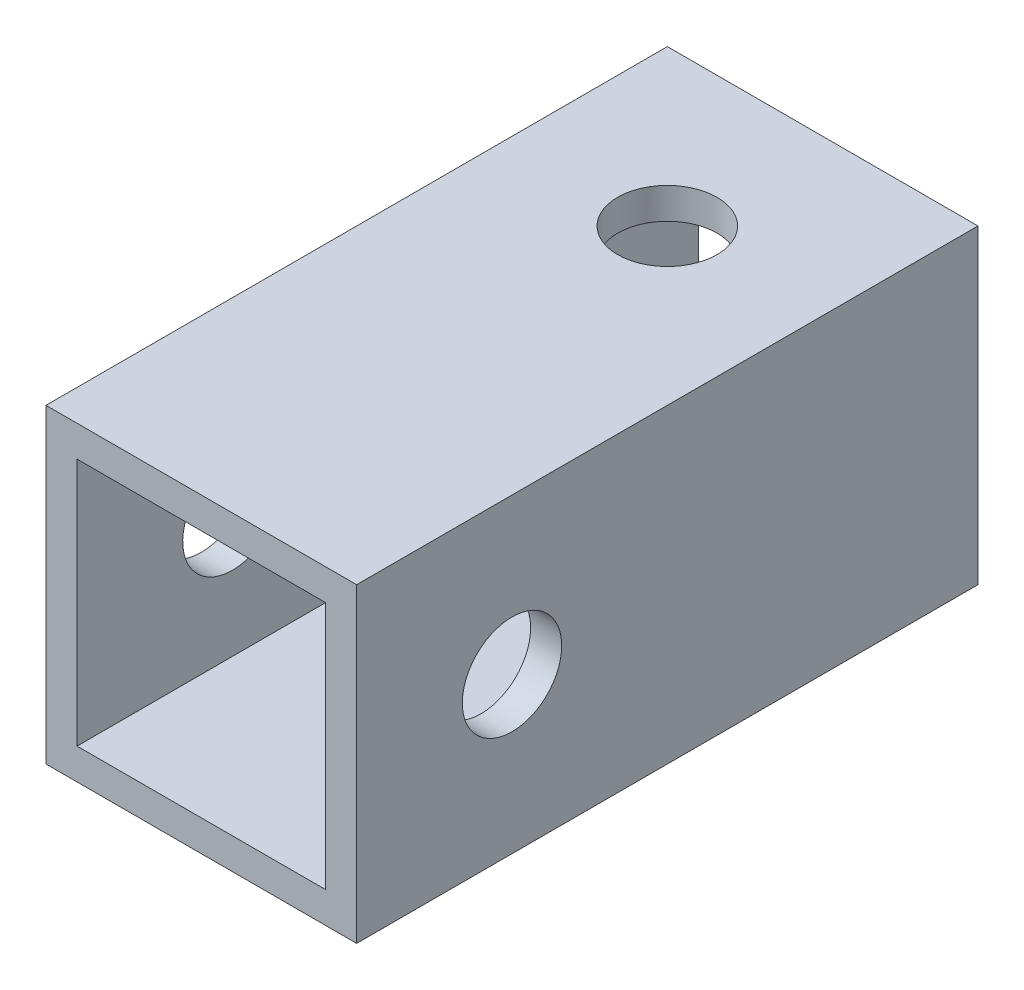
ISO-10303-21;
HEADER;
FILE_DESCRIPTION(('STEP AP214'),'2;1');
FILE_NAME('part.step','',(''),(''),'','','');
FILE_SCHEMA(('AUTOMOTIVE_DESIGN { 1 0 10303 214 1 1 1 1 }'));
ENDSEC;
DATA;
#1=APPLICATION_CONTEXT('core data for automotive mechanical design processes');
#2=APPLICATION_PROTOCOL_DEFINITION('international standard','automotive_design',2000,#1);
#3=PRODUCT_CONTEXT('',#1,'mechanical');
#4=PRODUCT('Part','Part','',(#3));
#5=PRODUCT_RELATED_PRODUCT_CATEGORY('part','',(#4));
#6=PRODUCT_DEFINITION_FORMATION('','',#4);
#7=PRODUCT_DEFINITION_CONTEXT('part definition',#1,'design');
#8=PRODUCT_DEFINITION('design','',#6,#7);
#9=PRODUCT_DEFINITION_SHAPE('','',#8);
#10=(LENGTH_UNIT() NAMED_UNIT(*) SI_UNIT(.MILLI.,.METRE.));
#11=(NAMED_UNIT(*) PLANE_ANGLE_UNIT() SI_UNIT($,.RADIAN.));
#12=(NAMED_UNIT(*) SI_UNIT($,.STERADIAN.) SOLID_ANGLE_UNIT());
#13=UNCERTAINTY_MEASURE_WITH_UNIT(LENGTH_MEASURE(1.E-05),#10,'distance_accuracy_value','');
#14=(GEOMETRIC_REPRESENTATION_CONTEXT(3) GLOBAL_UNCERTAINTY_ASSIGNED_CONTEXT((#13)) GLOBAL_UNIT_ASSIGNED_CONTEXT((#10,
#11,#12)) REPRESENTATION_CONTEXT('',''));
#15=CARTESIAN_POINT('',(0.,0.,0.));
#16=DIRECTION('',(0.,0.,1.));
#17=DIRECTION('',(1.,0.,0.));
#18=AXIS2_PLACEMENT_3D('',#15,#16,#17);
#19=CARTESIAN_POINT('',(0.,0.,20.));
#20=DIRECTION('',(0.,0.,1.));
#21=DIRECTION('',(1.,0.,0.));
#22=AXIS2_PLACEMENT_3D('',#19,#20,#21);
#23=PLANE('',#22);
#24=DIRECTION('',(0.,1.,0.));
#25=VECTOR('',#24,1.);
#26=CARTESIAN_POINT('',(5.,5.,20.));
#27=LINE('',#26,#25);
#28=CARTESIAN_POINT('',(5.,-5.,20.));
#29=VERTEX_POINT('',#28);
#30=CARTESIAN_POINT('',(5.,5.,20.));
#31=VERTEX_POINT('',#30);
#32=EDGE_CURVE('E140',#29,#31,#27,.T.);
#33=ORIENTED_EDGE('',*,*,#32,.T.);
#34=DIRECTION('',(-1.,0.,0.));
#35=VECTOR('',#34,1.);
#36=CARTESIAN_POINT('',(-5.,5.,20.));
#37=LINE('',#36,#35);
#38=CARTESIAN_POINT('',(-5.,5.,20.));
#39=VERTEX_POINT('',#38);
#40=EDGE_CURVE('E143',#31,#39,#37,.T.);
#41=ORIENTED_EDGE('',*,*,#40,.T.);
#42=DIRECTION('',(0.,-1.,0.));
#43=VECTOR('',#42,1.);
#44=CARTESIAN_POINT('',(-5.,5.,20.));
#45=LINE('',#44,#43);
#46=CARTESIAN_POINT('',(-5.,-5.,20.));
#47=VERTEX_POINT('',#46);
#48=EDGE_CURVE('E146',#39,#47,#45,.T.);
#49=ORIENTED_EDGE('',*,*,#48,.T.);
#50=DIRECTION('',(1.,0.,0.));
#51=VECTOR('',#50,1.);
#52=CARTESIAN_POINT('',(-5.,-5.,20.));
#53=LINE('',#52,#51);
#54=EDGE_CURVE('E148',#47,#29,#53,.T.);
#55=ORIENTED_EDGE('',*,*,#54,.T.);
#56=EDGE_LOOP('',(#33,#41,#49,#55));
#57=FACE_BOUND('',#56,.T.);
#58=DIRECTION('',(0.,-1.,0.));
#59=VECTOR('',#58,1.);
#60=CARTESIAN_POINT('',(-4.,4.,20.));
#61=LINE('',#60,#59);
#62=CARTESIAN_POINT('',(-4.,4.,20.));
#63=VERTEX_POINT('',#62);
#64=CARTESIAN_POINT('',(-4.,-4.,20.));
#65=VERTEX_POINT('',#64);
#66=EDGE_CURVE('E110',#63,#65,#61,.T.);
#67=ORIENTED_EDGE('',*,*,#66,.F.);
#68=DIRECTION('',(-1.,0.,0.));
#69=VECTOR('',#68,1.);
#70=CARTESIAN_POINT('',(-4.,4.,20.));
#71=LINE('',#70,#69);
#72=CARTESIAN_POINT('',(4.,4.,20.));
#73=VERTEX_POINT('',#72);
#74=EDGE_CURVE('E102',#73,#63,#71,.T.);
#75=ORIENTED_EDGE('',*,*,#74,.F.);
#76=DIRECTION('',(0.,1.,0.));
#77=VECTOR('',#76,1.);
#78=CARTESIAN_POINT('',(4.,4.,20.));
#79=LINE('',#78,#77);
#80=CARTESIAN_POINT('',(4.,-4.,20.));
#81=VERTEX_POINT('',#80);
#82=EDGE_CURVE('E124',#81,#73,#79,.T.);
#83=ORIENTED_EDGE('',*,*,#82,.F.);
#84=DIRECTION('',(1.,0.,0.));
#85=VECTOR('',#84,1.);
#86=CARTESIAN_POINT('',(-4.,-4.,20.));
#87=LINE('',#86,#85);
#88=EDGE_CURVE('E122',#65,#81,#87,.T.);
#89=ORIENTED_EDGE('',*,*,#88,.F.);
#90=EDGE_LOOP('',(#67,#75,#83,#89));
#91=FACE_BOUND('',#90,.T.);
#92=ADVANCED_FACE('F35',(#57,#91),#23,.T.);
#93=CARTESIAN_POINT('',(0.,0.,0.));
#94=DIRECTION('',(0.,0.,1.));
#95=DIRECTION('',(1.,0.,0.));
#96=AXIS2_PLACEMENT_3D('',#93,#94,#95);
#97=PLANE('',#96);
#98=DIRECTION('',(0.,1.,0.));
#99=VECTOR('',#98,1.);
#100=CARTESIAN_POINT('',(5.,5.,0.));
#101=LINE('',#100,#99);
#102=CARTESIAN_POINT('',(5.,-5.,0.));
#103=VERTEX_POINT('',#102);
#104=CARTESIAN_POINT('',(5.,5.,0.));
#105=VERTEX_POINT('',#104);
#106=EDGE_CURVE('E118',#103,#105,#101,.T.);
#107=ORIENTED_EDGE('',*,*,#106,.F.);
#108=DIRECTION('',(1.,0.,0.));
#109=VECTOR('',#108,1.);
#110=CARTESIAN_POINT('',(-5.,-5.,0.));
#111=LINE('',#110,#109);
#112=CARTESIAN_POINT('',(-5.,-5.,0.));
#113=VERTEX_POINT('',#112);
#114=EDGE_CURVE('E144',#113,#103,#111,.T.);
#115=ORIENTED_EDGE('',*,*,#114,.F.);
#116=DIRECTION('',(0.,-1.,0.));
#117=VECTOR('',#116,1.);
#118=CARTESIAN_POINT('',(-5.,5.,0.));
#119=LINE('',#118,#117);
#120=CARTESIAN_POINT('',(-5.,5.,0.));
#121=VERTEX_POINT('',#120);
#122=EDGE_CURVE('E155',#121,#113,#119,.T.);
#123=ORIENTED_EDGE('',*,*,#122,.F.);
#124=DIRECTION('',(-1.,0.,0.));
#125=VECTOR('',#124,1.);
#126=CARTESIAN_POINT('',(-5.,5.,0.));
#127=LINE('',#126,#125);
#128=EDGE_CURVE('E153',#105,#121,#127,.T.);
#129=ORIENTED_EDGE('',*,*,#128,.F.);
#130=EDGE_LOOP('',(#107,#115,#123,#129));
#131=FACE_BOUND('',#130,.T.);
#132=DIRECTION('',(-1.,0.,0.));
#133=VECTOR('',#132,1.);
#134=CARTESIAN_POINT('',(-4.,4.,0.));
#135=LINE('',#134,#133);
#136=CARTESIAN_POINT('',(4.,4.,0.));
#137=VERTEX_POINT('',#136);
#138=CARTESIAN_POINT('',(-4.,4.,0.));
#139=VERTEX_POINT('',#138);
#140=EDGE_CURVE('E60',#137,#139,#135,.T.);
#141=ORIENTED_EDGE('',*,*,#140,.T.);
#142=DIRECTION('',(0.,-1.,0.));
#143=VECTOR('',#142,1.);
#144=CARTESIAN_POINT('',(-4.,4.,0.));
#145=LINE('',#144,#143);
#146=CARTESIAN_POINT('',(-4.,-4.,0.));
#147=VERTEX_POINT('',#146);
#148=EDGE_CURVE('E117',#139,#147,#145,.T.);
#149=ORIENTED_EDGE('',*,*,#148,.T.);
#150=DIRECTION('',(1.,0.,0.));
#151=VECTOR('',#150,1.);
#152=CARTESIAN_POINT('',(-4.,-4.,0.));
#153=LINE('',#152,#151);
#154=CARTESIAN_POINT('',(4.,-4.,0.));
#155=VERTEX_POINT('',#154);
#156=EDGE_CURVE('E132',#147,#155,#153,.T.);
#157=ORIENTED_EDGE('',*,*,#156,.T.);
#158=DIRECTION('',(0.,1.,0.));
#159=VECTOR('',#158,1.);
#160=CARTESIAN_POINT('',(4.,4.,0.));
#161=LINE('',#160,#159);
#162=EDGE_CURVE('E111',#155,#137,#161,.T.);
#163=ORIENTED_EDGE('',*,*,#162,.T.);
#164=EDGE_LOOP('',(#141,#149,#157,#163));
#165=FACE_BOUND('',#164,.T.);
#166=ADVANCED_FACE('F201',(#131,#165),#97,.F.);
#167=CARTESIAN_POINT('',(5.,5.,20.));
#168=DIRECTION('',(-1.,0.,0.));
#169=DIRECTION('',(0.,-1.,0.));
#170=AXIS2_PLACEMENT_3D('',#167,#168,#169);
#171=PLANE('',#170);
#172=CARTESIAN_POINT('',(5.,0.,15.));
#173=DIRECTION('',(-1.,0.,0.));
#174=DIRECTION('',(0.,-1.,0.));
#175=AXIS2_PLACEMENT_3D('',#172,#173,#174);
#176=CIRCLE('',#175,1.6);
#177=CARTESIAN_POINT('',(5.,-1.6,15.));
#178=VERTEX_POINT('',#177);
#179=EDGE_CURVE('E184',#178,#178,#176,.T.);
#180=ORIENTED_EDGE('',*,*,#179,.T.);
#181=EDGE_LOOP('',(#180));
#182=FACE_BOUND('',#181,.T.);
#183=ORIENTED_EDGE('',*,*,#106,.T.);
#184=DIRECTION('',(0.,0.,-1.));
#185=VECTOR('',#184,1.);
#186=CARTESIAN_POINT('',(5.,5.,20.));
#187=LINE('',#186,#185);
#188=EDGE_CURVE('E11',#31,#105,#187,.T.);
#189=ORIENTED_EDGE('',*,*,#188,.F.);
#190=ORIENTED_EDGE('',*,*,#32,.F.);
#191=DIRECTION('',(0.,0.,-1.));
#192=VECTOR('',#191,1.);
#193=CARTESIAN_POINT('',(5.,-5.,20.));
#194=LINE('',#193,#192);
#195=EDGE_CURVE('E150',#29,#103,#194,.T.);
#196=ORIENTED_EDGE('',*,*,#195,.T.);
#197=EDGE_LOOP('',(#183,#189,#190,#196));
#198=FACE_BOUND('',#197,.T.);
#199=ADVANCED_FACE('F37',(#182,#198),#171,.F.);
#200=CARTESIAN_POINT('',(-5.,5.,20.));
#201=DIRECTION('',(0.,-1.,0.));
#202=DIRECTION('',(0.,0.,-1.));
#203=AXIS2_PLACEMENT_3D('',#200,#201,#202);
#204=PLANE('',#203);
#205=CARTESIAN_POINT('',(0.,5.,5.));
#206=DIRECTION('',(0.,1.,0.));
#207=DIRECTION('',(0.,0.,1.));
#208=AXIS2_PLACEMENT_3D('',#205,#206,#207);
#209=CIRCLE('',#208,1.6);
#210=CARTESIAN_POINT('',(0.,5.,6.6));
#211=VERTEX_POINT('',#210);
#212=EDGE_CURVE('E171',#211,#211,#209,.T.);
#213=ORIENTED_EDGE('',*,*,#212,.F.);
#214=EDGE_LOOP('',(#213));
#215=FACE_BOUND('',#214,.T.);
#216=ORIENTED_EDGE('',*,*,#128,.T.);
#217=DIRECTION('',(0.,0.,-1.));
#218=VECTOR('',#217,1.);
#219=CARTESIAN_POINT('',(-5.,5.,20.));
#220=LINE('',#219,#218);
#221=EDGE_CURVE('E44',#39,#121,#220,.T.);
#222=ORIENTED_EDGE('',*,*,#221,.F.);
#223=ORIENTED_EDGE('',*,*,#40,.F.);
#224=ORIENTED_EDGE('',*,*,#188,.T.);
#225=EDGE_LOOP('',(#216,#222,#223,#224));
#226=FACE_BOUND('',#225,.T.);
#227=ADVANCED_FACE('F226',(#215,#226),#204,.F.);
#228=CARTESIAN_POINT('',(-5.,5.,20.));
#229=DIRECTION('',(1.,0.,0.));
#230=DIRECTION('',(0.,1.,0.));
#231=AXIS2_PLACEMENT_3D('',#228,#229,#230);
#232=PLANE('',#231);
#233=CARTESIAN_POINT('',(-5.,0.,15.));
#234=DIRECTION('',(-1.,0.,0.));
#235=DIRECTION('',(0.,-1.,0.));
#236=AXIS2_PLACEMENT_3D('',#233,#234,#235);
#237=CIRCLE('',#236,1.6);
#238=CARTESIAN_POINT('',(-5.,-1.6,15.));
#239=VERTEX_POINT('',#238);
#240=EDGE_CURVE('E181',#239,#239,#237,.T.);
#241=ORIENTED_EDGE('',*,*,#240,.F.);
#242=EDGE_LOOP('',(#241));
#243=FACE_BOUND('',#242,.T.);
#244=ORIENTED_EDGE('',*,*,#122,.T.);
#245=DIRECTION('',(0.,0.,-1.));
#246=VECTOR('',#245,1.);
#247=CARTESIAN_POINT('',(-5.,-5.,20.));
#248=LINE('',#247,#246);
#249=EDGE_CURVE('E160',#47,#113,#248,.T.);
#250=ORIENTED_EDGE('',*,*,#249,.F.);
#251=ORIENTED_EDGE('',*,*,#48,.F.);
#252=ORIENTED_EDGE('',*,*,#221,.T.);
#253=EDGE_LOOP('',(#244,#250,#251,#252));
#254=FACE_BOUND('',#253,.T.);
#255=ADVANCED_FACE('F224',(#243,#254),#232,.F.);
#256=CARTESIAN_POINT('',(-5.,-5.,20.));
#257=DIRECTION('',(0.,1.,0.));
#258=DIRECTION('',(0.,0.,1.));
#259=AXIS2_PLACEMENT_3D('',#256,#257,#258);
#260=PLANE('',#259);
#261=CARTESIAN_POINT('',(0.,-5.,5.));
#262=DIRECTION('',(0.,1.,0.));
#263=DIRECTION('',(0.,0.,1.));
#264=AXIS2_PLACEMENT_3D('',#261,#262,#263);
#265=CIRCLE('',#264,1.6);
#266=CARTESIAN_POINT('',(0.,-5.,6.6));
#267=VERTEX_POINT('',#266);
#268=EDGE_CURVE('E166',#267,#267,#265,.T.);
#269=ORIENTED_EDGE('',*,*,#268,.T.);
#270=EDGE_LOOP('',(#269));
#271=FACE_BOUND('',#270,.T.);
#272=ORIENTED_EDGE('',*,*,#114,.T.);
#273=ORIENTED_EDGE('',*,*,#195,.F.);
#274=ORIENTED_EDGE('',*,*,#54,.F.);
#275=ORIENTED_EDGE('',*,*,#249,.T.);
#276=EDGE_LOOP('',(#272,#273,#274,#275));
#277=FACE_BOUND('',#276,.T.);
#278=ADVANCED_FACE('F221',(#271,#277),#260,.F.);
#279=CARTESIAN_POINT('',(-4.,4.,20.));
#280=DIRECTION('',(0.,-1.,0.));
#281=DIRECTION('',(0.,0.,-1.));
#282=AXIS2_PLACEMENT_3D('',#279,#280,#281);
#283=PLANE('',#282);
#284=CARTESIAN_POINT('',(0.,4.,5.));
#285=DIRECTION('',(0.,-1.,0.));
#286=DIRECTION('',(0.,0.,-1.));
#287=AXIS2_PLACEMENT_3D('',#284,#285,#286);
#288=CIRCLE('',#287,1.6);
#289=CARTESIAN_POINT('',(0.,4.,3.4));
#290=VERTEX_POINT('',#289);
#291=EDGE_CURVE('E130',#290,#290,#288,.T.);
#292=ORIENTED_EDGE('',*,*,#291,.F.);
#293=EDGE_LOOP('',(#292));
#294=FACE_BOUND('',#293,.T.);
#295=ORIENTED_EDGE('',*,*,#140,.F.);
#296=DIRECTION('',(0.,0.,-1.));
#297=VECTOR('',#296,1.);
#298=CARTESIAN_POINT('',(4.,4.,20.));
#299=LINE('',#298,#297);
#300=EDGE_CURVE('E106',#73,#137,#299,.T.);
#301=ORIENTED_EDGE('',*,*,#300,.F.);
#302=ORIENTED_EDGE('',*,*,#74,.T.);
#303=DIRECTION('',(0.,0.,-1.));
#304=VECTOR('',#303,1.);
#305=CARTESIAN_POINT('',(-4.,4.,20.));
#306=LINE('',#305,#304);
#307=EDGE_CURVE('E105',#63,#139,#306,.T.);
#308=ORIENTED_EDGE('',*,*,#307,.T.);
#309=EDGE_LOOP('',(#295,#301,#302,#308));
#310=FACE_BOUND('',#309,.T.);
#311=ADVANCED_FACE('F104',(#294,#310),#283,.T.);
#312=CARTESIAN_POINT('',(-4.,4.,20.));
#313=DIRECTION('',(1.,0.,0.));
#314=DIRECTION('',(0.,1.,0.));
#315=AXIS2_PLACEMENT_3D('',#312,#313,#314);
#316=PLANE('',#315);
#317=CARTESIAN_POINT('',(-4.,0.,15.));
#318=DIRECTION('',(1.,0.,0.));
#319=DIRECTION('',(0.,1.,0.));
#320=AXIS2_PLACEMENT_3D('',#317,#318,#319);
#321=CIRCLE('',#320,1.6);
#322=CARTESIAN_POINT('',(-4.,-1.6,15.));
#323=VERTEX_POINT('',#322);
#324=EDGE_CURVE('E176',#323,#323,#321,.T.);
#325=ORIENTED_EDGE('',*,*,#324,.F.);
#326=EDGE_LOOP('',(#325));
#327=FACE_BOUND('',#326,.T.);
#328=ORIENTED_EDGE('',*,*,#148,.F.);
#329=ORIENTED_EDGE('',*,*,#307,.F.);
#330=ORIENTED_EDGE('',*,*,#66,.T.);
#331=DIRECTION('',(0.,0.,-1.));
#332=VECTOR('',#331,1.);
#333=CARTESIAN_POINT('',(-4.,-4.,20.));
#334=LINE('',#333,#332);
#335=EDGE_CURVE('E119',#65,#147,#334,.T.);
#336=ORIENTED_EDGE('',*,*,#335,.T.);
#337=EDGE_LOOP('',(#328,#329,#330,#336));
#338=FACE_BOUND('',#337,.T.);
#339=ADVANCED_FACE('F114',(#327,#338),#316,.T.);
#340=CARTESIAN_POINT('',(-4.,-4.,20.));
#341=DIRECTION('',(0.,1.,0.));
#342=DIRECTION('',(0.,0.,1.));
#343=AXIS2_PLACEMENT_3D('',#340,#341,#342);
#344=PLANE('',#343);
#345=CARTESIAN_POINT('',(0.,-4.,5.));
#346=DIRECTION('',(0.,1.,0.));
#347=DIRECTION('',(0.,0.,1.));
#348=AXIS2_PLACEMENT_3D('',#345,#346,#347);
#349=CIRCLE('',#348,1.6);
#350=CARTESIAN_POINT('',(0.,-4.,6.6));
#351=VERTEX_POINT('',#350);
#352=EDGE_CURVE('E164',#351,#351,#349,.T.);
#353=ORIENTED_EDGE('',*,*,#352,.F.);
#354=EDGE_LOOP('',(#353));
#355=FACE_BOUND('',#354,.T.);
#356=ORIENTED_EDGE('',*,*,#156,.F.);
#357=ORIENTED_EDGE('',*,*,#335,.F.);
#358=ORIENTED_EDGE('',*,*,#88,.T.);
#359=DIRECTION('',(0.,0.,-1.));
#360=VECTOR('',#359,1.);
#361=CARTESIAN_POINT('',(4.,-4.,20.));
#362=LINE('',#361,#360);
#363=EDGE_CURVE('E52',#81,#155,#362,.T.);
#364=ORIENTED_EDGE('',*,*,#363,.T.);
#365=EDGE_LOOP('',(#356,#357,#358,#364));
#366=FACE_BOUND('',#365,.T.);
#367=ADVANCED_FACE('F197',(#355,#366),#344,.T.);
#368=CARTESIAN_POINT('',(4.,4.,20.));
#369=DIRECTION('',(-1.,0.,0.));
#370=DIRECTION('',(0.,-1.,0.));
#371=AXIS2_PLACEMENT_3D('',#368,#369,#370);
#372=PLANE('',#371);
#373=CARTESIAN_POINT('',(4.,0.,15.));
#374=DIRECTION('',(-1.,0.,0.));
#375=DIRECTION('',(0.,-1.,0.));
#376=AXIS2_PLACEMENT_3D('',#373,#374,#375);
#377=CIRCLE('',#376,1.6);
#378=CARTESIAN_POINT('',(4.,-1.6,15.));
#379=VERTEX_POINT('',#378);
#380=EDGE_CURVE('E39',#379,#379,#377,.T.);
#381=ORIENTED_EDGE('',*,*,#380,.F.);
#382=EDGE_LOOP('',(#381));
#383=FACE_BOUND('',#382,.T.);
#384=ORIENTED_EDGE('',*,*,#162,.F.);
#385=ORIENTED_EDGE('',*,*,#363,.F.);
#386=ORIENTED_EDGE('',*,*,#82,.T.);
#387=ORIENTED_EDGE('',*,*,#300,.T.);
#388=EDGE_LOOP('',(#384,#385,#386,#387));
#389=FACE_BOUND('',#388,.T.);
#390=ADVANCED_FACE('F194',(#383,#389),#372,.T.);
#391=CARTESIAN_POINT('',(0.,-5.,5.));
#392=DIRECTION('',(0.,1.,0.));
#393=DIRECTION('',(0.,0.,1.));
#394=AXIS2_PLACEMENT_3D('',#391,#392,#393);
#395=CYLINDRICAL_SURFACE('',#394,1.6);
#396=ORIENTED_EDGE('',*,*,#352,.T.);
#397=EDGE_LOOP('',(#396));
#398=FACE_BOUND('',#397,.T.);
#399=ORIENTED_EDGE('',*,*,#268,.F.);
#400=EDGE_LOOP('',(#399));
#401=FACE_BOUND('',#400,.T.);
#402=ADVANCED_FACE('F196',(#398,#401),#395,.F.);
#403=ORIENTED_EDGE('',*,*,#291,.T.);
#404=EDGE_LOOP('',(#403));
#405=FACE_BOUND('',#404,.T.);
#406=ORIENTED_EDGE('',*,*,#212,.T.);
#407=EDGE_LOOP('',(#406));
#408=FACE_BOUND('',#407,.T.);
#409=ADVANCED_FACE('F249',(#405,#408),#395,.F.);
#410=CARTESIAN_POINT('',(5.,0.,15.));
#411=DIRECTION('',(-1.,0.,0.));
#412=DIRECTION('',(0.,-1.,0.));
#413=AXIS2_PLACEMENT_3D('',#410,#411,#412);
#414=CYLINDRICAL_SURFACE('',#413,1.6);
#415=CARTESIAN_POINT('',(4.,-1.6,15.));
#416=CARTESIAN_POINT('',(4.01041666666667,-1.6,15.));
#417=CARTESIAN_POINT('',(4.02083333333333,-1.6,15.));
#418=CARTESIAN_POINT('',(4.04166666666667,-1.6,15.));
#419=CARTESIAN_POINT('',(4.05208333333333,-1.6,15.));
#420=CARTESIAN_POINT('',(4.07291666666667,-1.6,15.));
#421=CARTESIAN_POINT('',(4.08333333333333,-1.6,15.));
#422=CARTESIAN_POINT('',(4.10416666666667,-1.6,15.));
#423=CARTESIAN_POINT('',(4.11458333333333,-1.6,15.));
#424=CARTESIAN_POINT('',(4.13541666666667,-1.6,15.));
#425=CARTESIAN_POINT('',(4.14583333333333,-1.6,15.));
#426=CARTESIAN_POINT('',(4.16666666666667,-1.6,15.));
#427=CARTESIAN_POINT('',(4.17708333333333,-1.6,15.));
#428=CARTESIAN_POINT('',(4.19791666666667,-1.6,15.));
#429=CARTESIAN_POINT('',(4.20833333333333,-1.6,15.));
#430=CARTESIAN_POINT('',(4.22916666666667,-1.6,15.));
#431=CARTESIAN_POINT('',(4.23958333333333,-1.6,15.));
#432=CARTESIAN_POINT('',(4.26041666666667,-1.6,15.));
#433=CARTESIAN_POINT('',(4.27083333333333,-1.6,15.));
#434=CARTESIAN_POINT('',(4.29166666666667,-1.6,15.));
#435=CARTESIAN_POINT('',(4.30208333333333,-1.6,15.));
#436=CARTESIAN_POINT('',(4.32291666666667,-1.6,15.));
#437=CARTESIAN_POINT('',(4.33333333333333,-1.6,15.));
#438=CARTESIAN_POINT('',(4.35416666666667,-1.6,15.));
#439=CARTESIAN_POINT('',(4.36458333333333,-1.6,15.));
#440=CARTESIAN_POINT('',(4.38541666666667,-1.6,15.));
#441=CARTESIAN_POINT('',(4.39583333333333,-1.6,15.));
#442=CARTESIAN_POINT('',(4.41666666666667,-1.6,15.));
#443=CARTESIAN_POINT('',(4.42708333333333,-1.6,15.));
#444=CARTESIAN_POINT('',(4.44791666666667,-1.6,15.));
#445=CARTESIAN_POINT('',(4.45833333333333,-1.6,15.));
#446=CARTESIAN_POINT('',(4.47916666666667,-1.6,15.));
#447=CARTESIAN_POINT('',(4.48958333333333,-1.6,15.));
#448=CARTESIAN_POINT('',(4.51041666666667,-1.6,15.));
#449=CARTESIAN_POINT('',(4.52083333333333,-1.6,15.));
#450=CARTESIAN_POINT('',(4.54166666666667,-1.6,15.));
#451=CARTESIAN_POINT('',(4.55208333333333,-1.6,15.));
#452=CARTESIAN_POINT('',(4.57291666666667,-1.6,15.));
#453=CARTESIAN_POINT('',(4.58333333333334,-1.6,15.));
#454=CARTESIAN_POINT('',(4.60416666666667,-1.6,15.));
#455=CARTESIAN_POINT('',(4.61458333333334,-1.6,15.));
#456=CARTESIAN_POINT('',(4.63541666666667,-1.6,15.));
#457=CARTESIAN_POINT('',(4.64583333333334,-1.6,15.));
#458=CARTESIAN_POINT('',(4.66666666666667,-1.6,15.));
#459=CARTESIAN_POINT('',(4.67708333333334,-1.6,15.));
#460=CARTESIAN_POINT('',(4.69791666666667,-1.6,15.));
#461=CARTESIAN_POINT('',(4.70833333333334,-1.6,15.));
#462=CARTESIAN_POINT('',(4.72916666666667,-1.6,15.));
#463=CARTESIAN_POINT('',(4.73958333333334,-1.6,15.));
#464=CARTESIAN_POINT('',(4.76041666666667,-1.6,15.));
#465=CARTESIAN_POINT('',(4.77083333333334,-1.6,15.));
#466=CARTESIAN_POINT('',(4.79166666666667,-1.6,15.));
#467=CARTESIAN_POINT('',(4.80208333333334,-1.6,15.));
#468=CARTESIAN_POINT('',(4.82291666666667,-1.6,15.));
#469=CARTESIAN_POINT('',(4.83333333333334,-1.6,15.));
#470=CARTESIAN_POINT('',(4.85416666666667,-1.6,15.));
#471=CARTESIAN_POINT('',(4.86458333333334,-1.6,15.));
#472=CARTESIAN_POINT('',(4.88541666666667,-1.6,15.));
#473=CARTESIAN_POINT('',(4.89583333333334,-1.6,15.));
#474=CARTESIAN_POINT('',(4.91666666666667,-1.6,15.));
#475=CARTESIAN_POINT('',(4.92708333333334,-1.6,15.));
#476=CARTESIAN_POINT('',(4.94791666666667,-1.6,15.));
#477=CARTESIAN_POINT('',(4.95833333333334,-1.6,15.));
#478=CARTESIAN_POINT('',(4.97916666666667,-1.6,15.));
#479=CARTESIAN_POINT('',(4.98958333333334,-1.6,15.));
#480=CARTESIAN_POINT('',(5.,-1.6,15.));
#481=B_SPLINE_CURVE_WITH_KNOTS('',3,(#415,#416,#417,#418,#419,#420,#421,#422,#423,#424,#425,
#426,#427,#428,#429,#430,#431,#432,#433,#434,#435,#436,#437,#438,#439,#440,#441,#442,#443,#444,
#445,#446,#447,#448,#449,#450,#451,#452,#453,#454,#455,#456,#457,#458,#459,#460,#461,#462,#463,
#464,#465,#466,#467,#468,#469,#470,#471,#472,#473,#474,#475,#476,#477,#478,#479,#480),
.UNSPECIFIED.,.F.,.F.,(4,2,2,2,2,2,2,2,2,2,2,2,2,2,2,2,2,2,2,2,2,2,2,2,2,2,2,2,2,2,2,2,4),(0.,
0.03125,0.0625000000000001,0.0937500000000009,0.125000000000001,0.156250000000001,
0.187500000000001,0.218750000000001,0.250000000000001,0.281250000000001,0.312500000000001,
0.343750000000002,0.375000000000002,0.406250000000002,0.437500000000002,0.468750000000002,
0.500000000000002,0.531250000000002,0.562500000000003,0.593750000000003,0.625000000000003,
0.656250000000003,0.687500000000003,0.718750000000003,0.750000000000003,0.781250000000004,
0.812500000000004,0.843750000000004,0.875000000000004,0.906250000000004,0.937500000000004,
0.968750000000004,1.),.UNSPECIFIED.);
#482=EDGE_CURVE('BSEAM191',#379,#178,#481,.T.);
#483=ORIENTED_EDGE('',*,*,#380,.T.);
#484=ORIENTED_EDGE('',*,*,#179,.F.);
#485=ORIENTED_EDGE('',*,*,#482,.T.);
#486=ORIENTED_EDGE('',*,*,#482,.F.);
#487=EDGE_LOOP('',(#483,#485,#484,#486));
#488=FACE_BOUND('',#487,.T.);
#489=ADVANCED_FACE('F191',(#488),#414,.F.);
#490=CARTESIAN_POINT('',(-4.,-1.6,15.));
#491=CARTESIAN_POINT('',(-4.01041666666667,-1.6,15.));
#492=CARTESIAN_POINT('',(-4.02083333333333,-1.6,15.));
#493=CARTESIAN_POINT('',(-4.04166666666667,-1.6,15.));
#494=CARTESIAN_POINT('',(-4.05208333333333,-1.6,15.));
#495=CARTESIAN_POINT('',(-4.07291666666667,-1.6,15.));
#496=CARTESIAN_POINT('',(-4.08333333333333,-1.6,15.));
#497=CARTESIAN_POINT('',(-4.10416666666667,-1.6,15.));
#498=CARTESIAN_POINT('',(-4.11458333333333,-1.6,15.));
#499=CARTESIAN_POINT('',(-4.13541666666667,-1.6,15.));
#500=CARTESIAN_POINT('',(-4.14583333333333,-1.6,15.));
#501=CARTESIAN_POINT('',(-4.16666666666667,-1.6,15.));
#502=CARTESIAN_POINT('',(-4.17708333333333,-1.6,15.));
#503=CARTESIAN_POINT('',(-4.19791666666667,-1.6,15.));
#504=CARTESIAN_POINT('',(-4.20833333333333,-1.6,15.));
#505=CARTESIAN_POINT('',(-4.22916666666667,-1.6,15.));
#506=CARTESIAN_POINT('',(-4.23958333333333,-1.6,15.));
#507=CARTESIAN_POINT('',(-4.26041666666667,-1.6,15.));
#508=CARTESIAN_POINT('',(-4.27083333333333,-1.6,15.));
#509=CARTESIAN_POINT('',(-4.29166666666667,-1.6,15.));
#510=CARTESIAN_POINT('',(-4.30208333333333,-1.6,15.));
#511=CARTESIAN_POINT('',(-4.32291666666667,-1.6,15.));
#512=CARTESIAN_POINT('',(-4.33333333333333,-1.6,15.));
#513=CARTESIAN_POINT('',(-4.35416666666667,-1.6,15.));
#514=CARTESIAN_POINT('',(-4.36458333333333,-1.6,15.));
#515=CARTESIAN_POINT('',(-4.38541666666667,-1.6,15.));
#516=CARTESIAN_POINT('',(-4.39583333333333,-1.6,15.));
#517=CARTESIAN_POINT('',(-4.41666666666667,-1.6,15.));
#518=CARTESIAN_POINT('',(-4.42708333333333,-1.6,15.));
#519=CARTESIAN_POINT('',(-4.44791666666667,-1.6,15.));
#520=CARTESIAN_POINT('',(-4.45833333333333,-1.6,15.));
#521=CARTESIAN_POINT('',(-4.47916666666667,-1.6,15.));
#522=CARTESIAN_POINT('',(-4.48958333333333,-1.6,15.));
#523=CARTESIAN_POINT('',(-4.51041666666667,-1.6,15.));
#524=CARTESIAN_POINT('',(-4.52083333333333,-1.6,15.));
#525=CARTESIAN_POINT('',(-4.54166666666667,-1.6,15.));
#526=CARTESIAN_POINT('',(-4.55208333333333,-1.6,15.));
#527=CARTESIAN_POINT('',(-4.57291666666667,-1.6,15.));
#528=CARTESIAN_POINT('',(-4.58333333333333,-1.6,15.));
#529=CARTESIAN_POINT('',(-4.60416666666667,-1.6,15.));
#530=CARTESIAN_POINT('',(-4.61458333333333,-1.6,15.));
#531=CARTESIAN_POINT('',(-4.63541666666667,-1.6,15.));
#532=CARTESIAN_POINT('',(-4.64583333333333,-1.6,15.));
#533=CARTESIAN_POINT('',(-4.66666666666667,-1.6,15.));
#534=CARTESIAN_POINT('',(-4.67708333333333,-1.6,15.));
#535=CARTESIAN_POINT('',(-4.69791666666667,-1.6,15.));
#536=CARTESIAN_POINT('',(-4.70833333333333,-1.6,15.));
#537=CARTESIAN_POINT('',(-4.72916666666667,-1.6,15.));
#538=CARTESIAN_POINT('',(-4.73958333333333,-1.6,15.));
#539=CARTESIAN_POINT('',(-4.76041666666667,-1.6,15.));
#540=CARTESIAN_POINT('',(-4.77083333333333,-1.6,15.));
#541=CARTESIAN_POINT('',(-4.79166666666667,-1.6,15.));
#542=CARTESIAN_POINT('',(-4.80208333333333,-1.6,15.));
#543=CARTESIAN_POINT('',(-4.82291666666667,-1.6,15.));
#544=CARTESIAN_POINT('',(-4.83333333333333,-1.6,15.));
#545=CARTESIAN_POINT('',(-4.85416666666667,-1.6,15.));
#546=CARTESIAN_POINT('',(-4.86458333333333,-1.6,15.));
#547=CARTESIAN_POINT('',(-4.88541666666667,-1.6,15.));
#548=CARTESIAN_POINT('',(-4.89583333333333,-1.6,15.));
#549=CARTESIAN_POINT('',(-4.91666666666667,-1.6,15.));
#550=CARTESIAN_POINT('',(-4.92708333333333,-1.6,15.));
#551=CARTESIAN_POINT('',(-4.94791666666667,-1.6,15.));
#552=CARTESIAN_POINT('',(-4.95833333333333,-1.6,15.));
#553=CARTESIAN_POINT('',(-4.97916666666667,-1.6,15.));
#554=CARTESIAN_POINT('',(-4.98958333333333,-1.6,15.));
#555=CARTESIAN_POINT('',(-5.,-1.6,15.));
#556=B_SPLINE_CURVE_WITH_KNOTS('',3,(#490,#491,#492,#493,#494,#495,#496,#497,#498,#499,#500,
#501,#502,#503,#504,#505,#506,#507,#508,#509,#510,#511,#512,#513,#514,#515,#516,#517,#518,#519,
#520,#521,#522,#523,#524,#525,#526,#527,#528,#529,#530,#531,#532,#533,#534,#535,#536,#537,#538,
#539,#540,#541,#542,#543,#544,#545,#546,#547,#548,#549,#550,#551,#552,#553,#554,#555),
.UNSPECIFIED.,.F.,.F.,(4,2,2,2,2,2,2,2,2,2,2,2,2,2,2,2,2,2,2,2,2,2,2,2,2,2,2,2,2,2,2,2,4),(0.,
0.03125,0.0625000000000001,0.0937500000000001,0.125,0.15625,0.1875,0.21875,0.25,0.28125,0.3125,
0.34375,0.375,0.40625,0.4375,0.46875,0.5,0.53125,0.5625,0.593750000000001,0.625000000000001,
0.656250000000001,0.687500000000001,0.718750000000001,0.750000000000001,0.781250000000001,
0.812500000000001,0.843750000000001,0.875000000000001,0.906250000000001,0.937500000000001,
0.968750000000001,1.),.UNSPECIFIED.);
#557=EDGE_CURVE('BSEAM257',#323,#239,#556,.T.);
#558=ORIENTED_EDGE('',*,*,#324,.T.);
#559=ORIENTED_EDGE('',*,*,#240,.T.);
#560=ORIENTED_EDGE('',*,*,#557,.T.);
#561=ORIENTED_EDGE('',*,*,#557,.F.);
#562=EDGE_LOOP('',(#558,#560,#559,#561));
#563=FACE_BOUND('',#562,.T.);
#564=ADVANCED_FACE('F257',(#563),#414,.F.);
#565=CLOSED_SHELL('',(#92,#166,#199,#227,#255,#278,#311,#339,#367,#390,#402,#409,#489,#564));
#566=MANIFOLD_SOLID_BREP('B2',#565);
#567=ADVANCED_BREP_SHAPE_REPRESENTATION('',(#18,#566),#14);
#568=SHAPE_DEFINITION_REPRESENTATION(#9,#567);
ENDSEC;
END-ISO-10303-21;
